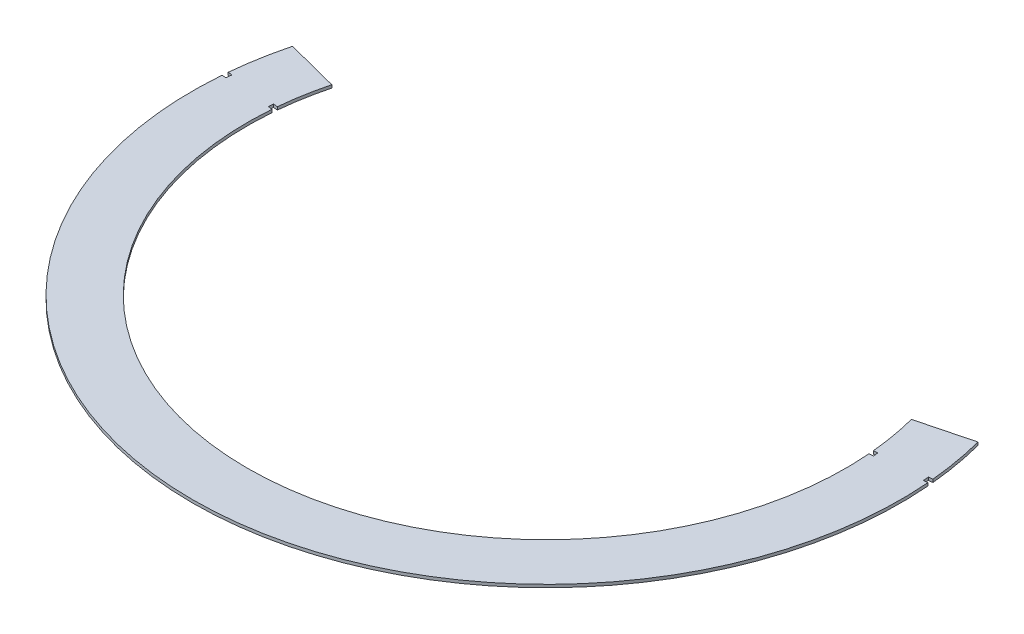
ISO-10303-21;
HEADER;
FILE_DESCRIPTION(('STEP AP214'),'2;1');
FILE_NAME('part.step','',(''),(''),'','','');
FILE_SCHEMA(('AUTOMOTIVE_DESIGN { 1 0 10303 214 1 1 1 1 }'));
ENDSEC;
DATA;
#1=APPLICATION_CONTEXT('core data for automotive mechanical design processes');
#2=APPLICATION_PROTOCOL_DEFINITION('international standard','automotive_design',2000,#1);
#3=PRODUCT_CONTEXT('',#1,'mechanical');
#4=PRODUCT('Part','Part','',(#3));
#5=PRODUCT_RELATED_PRODUCT_CATEGORY('part','',(#4));
#6=PRODUCT_DEFINITION_FORMATION('','',#4);
#7=PRODUCT_DEFINITION_CONTEXT('part definition',#1,'design');
#8=PRODUCT_DEFINITION('design','',#6,#7);
#9=PRODUCT_DEFINITION_SHAPE('','',#8);
#10=(LENGTH_UNIT() NAMED_UNIT(*) SI_UNIT(.MILLI.,.METRE.));
#11=(NAMED_UNIT(*) PLANE_ANGLE_UNIT() SI_UNIT($,.RADIAN.));
#12=(NAMED_UNIT(*) SI_UNIT($,.STERADIAN.) SOLID_ANGLE_UNIT());
#13=UNCERTAINTY_MEASURE_WITH_UNIT(LENGTH_MEASURE(1.E-05),#10,'distance_accuracy_value','');
#14=(GEOMETRIC_REPRESENTATION_CONTEXT(3) GLOBAL_UNCERTAINTY_ASSIGNED_CONTEXT((#13)) GLOBAL_UNIT_ASSIGNED_CONTEXT((#10,
#11,#12)) REPRESENTATION_CONTEXT('',''));
#15=CARTESIAN_POINT('',(0.,0.,0.));
#16=DIRECTION('',(0.,0.,1.));
#17=DIRECTION('',(1.,0.,0.));
#18=AXIS2_PLACEMENT_3D('',#15,#16,#17);
#19=CARTESIAN_POINT('',(-70.9920846280338,0.35,-5.69318190172193));
#20=DIRECTION('',(-0.0799379654833183,0.,0.996799840326225));
#21=DIRECTION('',(0.996799840326225,0.,0.0799379654833183));
#22=AXIS2_PLACEMENT_3D('',#19,#20,#21);
#23=PLANE('',#22);
#24=DIRECTION('',(0.,1.,0.));
#25=VECTOR('',#24,1.);
#26=CARTESIAN_POINT('',(-71.9797048813756,-21.7035849312303,-5.77238371388958));
#27=LINE('',#26,#25);
#28=CARTESIAN_POINT('',(-71.9797048813756,-0.35,-5.77238371388958));
#29=VERTEX_POINT('',#28);
#30=CARTESIAN_POINT('',(-71.9797048813756,0.35,-5.77238371388958));
#31=VERTEX_POINT('',#30);
#32=EDGE_CURVE('E59',#29,#31,#27,.T.);
#33=ORIENTED_EDGE('',*,*,#32,.T.);
#34=DIRECTION('',(-0.996799840326225,0.,-0.0799379654833183));
#35=VECTOR('',#34,1.);
#36=CARTESIAN_POINT('',(-70.9920846280338,0.35,-5.69318190172193));
#37=LINE('',#36,#35);
#38=CARTESIAN_POINT('',(-70.9920846280338,0.35,-5.69318190172193));
#39=VERTEX_POINT('',#38);
#40=EDGE_CURVE('E290',#39,#31,#37,.T.);
#41=ORIENTED_EDGE('',*,*,#40,.F.);
#42=DIRECTION('',(0.,-1.,0.));
#43=VECTOR('',#42,1.);
#44=CARTESIAN_POINT('',(-70.9920846280338,0.35,-5.69318190172193));
#45=LINE('',#44,#43);
#46=CARTESIAN_POINT('',(-70.9920846280338,-0.35,-5.69318190172193));
#47=VERTEX_POINT('',#46);
#48=EDGE_CURVE('E11',#39,#47,#45,.T.);
#49=ORIENTED_EDGE('',*,*,#48,.T.);
#50=DIRECTION('',(-0.996799840326225,0.,-0.0799379654833183));
#51=VECTOR('',#50,1.);
#52=CARTESIAN_POINT('',(-70.9920846280338,-0.35,-5.69318190172193));
#53=LINE('',#52,#51);
#54=EDGE_CURVE('E302',#47,#29,#53,.T.);
#55=ORIENTED_EDGE('',*,*,#54,.T.);
#56=EDGE_LOOP('',(#33,#41,#49,#55));
#57=FACE_BOUND('',#56,.T.);
#58=ADVANCED_FACE('F36',(#57),#23,.F.);
#59=CARTESIAN_POINT('',(70.9920846280338,0.35,-5.69318190172195));
#60=DIRECTION('',(0.0799379654833186,0.,0.996799840326225));
#61=DIRECTION('',(0.996799840326225,0.,-0.0799379654833186));
#62=AXIS2_PLACEMENT_3D('',#59,#60,#61);
#63=PLANE('',#62);
#64=DIRECTION('',(0.,1.,0.));
#65=VECTOR('',#64,1.);
#66=CARTESIAN_POINT('',(82.9642618126462,-21.7035849312303,-6.65328587428129));
#67=LINE('',#66,#65);
#68=CARTESIAN_POINT('',(82.9642618126462,-0.35,-6.65328587428129));
#69=VERTEX_POINT('',#68);
#70=CARTESIAN_POINT('',(82.9642618126462,0.35,-6.65328587428129));
#71=VERTEX_POINT('',#70);
#72=EDGE_CURVE('E271',#69,#71,#67,.T.);
#73=ORIENTED_EDGE('',*,*,#72,.T.);
#74=DIRECTION('',(-0.996799840326225,0.,0.0799379654833186));
#75=VECTOR('',#74,1.);
#76=CARTESIAN_POINT('',(70.9920846280338,0.35,-5.69318190172195));
#77=LINE('',#76,#75);
#78=CARTESIAN_POINT('',(83.9504825522747,0.35,-6.73237545300509));
#79=VERTEX_POINT('',#78);
#80=EDGE_CURVE('E295',#79,#71,#77,.T.);
#81=ORIENTED_EDGE('',*,*,#80,.F.);
#82=DIRECTION('',(0.,-1.,0.));
#83=VECTOR('',#82,1.);
#84=CARTESIAN_POINT('',(83.9504825522747,0.35,-6.73237545300509));
#85=LINE('',#84,#83);
#86=CARTESIAN_POINT('',(83.9504825522747,-0.35,-6.73237545300509));
#87=VERTEX_POINT('',#86);
#88=EDGE_CURVE('E310',#79,#87,#85,.T.);
#89=ORIENTED_EDGE('',*,*,#88,.T.);
#90=DIRECTION('',(-0.996799840326225,0.,0.0799379654833186));
#91=VECTOR('',#90,1.);
#92=CARTESIAN_POINT('',(70.9920846280338,-0.35,-5.69318190172195));
#93=LINE('',#92,#91);
#94=EDGE_CURVE('E289',#87,#69,#93,.T.);
#95=ORIENTED_EDGE('',*,*,#94,.T.);
#96=EDGE_LOOP('',(#73,#81,#89,#95));
#97=FACE_BOUND('',#96,.T.);
#98=ADVANCED_FACE('F325',(#97),#63,.F.);
#99=CARTESIAN_POINT('',(0.,0.35,0.));
#100=DIRECTION('',(0.,-1.,0.));
#101=DIRECTION('',(0.,0.,-1.));
#102=AXIS2_PLACEMENT_3D('',#99,#100,#101);
#103=CYLINDRICAL_SURFACE('',#102,71.22);
#104=CARTESIAN_POINT('',(0.,-0.35,0.));
#105=DIRECTION('',(0.,-1.,0.));
#106=DIRECTION('',(0.,0.,1.));
#107=AXIS2_PLACEMENT_3D('',#104,#105,#106);
#108=CIRCLE('',#107,71.22);
#109=CARTESIAN_POINT('',(70.9920846280338,-0.35,-5.69318190172195));
#110=VERTEX_POINT('',#109);
#111=EDGE_CURVE('E286',#110,#47,#108,.T.);
#112=ORIENTED_EDGE('',*,*,#111,.T.);
#113=ORIENTED_EDGE('',*,*,#48,.F.);
#114=CARTESIAN_POINT('',(0.,0.35,0.));
#115=DIRECTION('',(0.,-1.,0.));
#116=DIRECTION('',(0.,0.,1.));
#117=AXIS2_PLACEMENT_3D('',#114,#115,#116);
#118=CIRCLE('',#117,71.22);
#119=CARTESIAN_POINT('',(70.9920846280338,0.35,-5.69318190172195));
#120=VERTEX_POINT('',#119);
#121=EDGE_CURVE('E287',#120,#39,#118,.T.);
#122=ORIENTED_EDGE('',*,*,#121,.F.);
#123=DIRECTION('',(0.,-1.,0.));
#124=VECTOR('',#123,1.);
#125=CARTESIAN_POINT('',(70.9920846280338,0.35,-5.69318190172195));
#126=LINE('',#125,#124);
#127=EDGE_CURVE('E298',#120,#110,#126,.T.);
#128=ORIENTED_EDGE('',*,*,#127,.T.);
#129=EDGE_LOOP('',(#112,#113,#122,#128));
#130=FACE_BOUND('',#129,.T.);
#131=ADVANCED_FACE('F38',(#130),#103,.F.);
#132=CARTESIAN_POINT('',(-82.9642618126462,0.35,-6.65328587428127));
#133=VERTEX_POINT('',#132);
#134=CARTESIAN_POINT('',(-83.9504825522747,0.35,-6.7323754530051));
#135=VERTEX_POINT('',#134);
#136=EDGE_CURVE('E51',#133,#135,#37,.T.);
#137=ORIENTED_EDGE('',*,*,#136,.F.);
#138=DIRECTION('',(0.,1.,0.));
#139=VECTOR('',#138,1.);
#140=CARTESIAN_POINT('',(-82.9642618126462,-21.7035849312303,-6.65328587428127));
#141=LINE('',#140,#139);
#142=CARTESIAN_POINT('',(-82.9642618126462,-0.35,-6.65328587428127));
#143=VERTEX_POINT('',#142);
#144=EDGE_CURVE('E221',#143,#133,#141,.T.);
#145=ORIENTED_EDGE('',*,*,#144,.F.);
#146=CARTESIAN_POINT('',(-83.9504825522747,-0.35,-6.7323754530051));
#147=VERTEX_POINT('',#146);
#148=EDGE_CURVE('E301',#143,#147,#53,.T.);
#149=ORIENTED_EDGE('',*,*,#148,.T.);
#150=DIRECTION('',(0.,-1.,0.));
#151=VECTOR('',#150,1.);
#152=CARTESIAN_POINT('',(-83.9504825522747,0.35,-6.7323754530051));
#153=LINE('',#152,#151);
#154=EDGE_CURVE('E44',#135,#147,#153,.T.);
#155=ORIENTED_EDGE('',*,*,#154,.F.);
#156=EDGE_LOOP('',(#137,#145,#149,#155));
#157=FACE_BOUND('',#156,.T.);
#158=ADVANCED_FACE('F393',(#157),#23,.F.);
#159=CARTESIAN_POINT('',(0.,0.35,0.));
#160=DIRECTION('',(0.,-1.,0.));
#161=DIRECTION('',(0.,0.,-1.));
#162=AXIS2_PLACEMENT_3D('',#159,#160,#161);
#163=CYLINDRICAL_SURFACE('',#162,84.22);
#164=CARTESIAN_POINT('',(0.,-0.35,0.));
#165=DIRECTION('',(0.,1.,0.));
#166=DIRECTION('',(0.,0.,1.));
#167=AXIS2_PLACEMENT_3D('',#164,#165,#166);
#168=CIRCLE('',#167,84.22);
#169=EDGE_CURVE('E304',#147,#87,#168,.T.);
#170=ORIENTED_EDGE('',*,*,#169,.T.);
#171=ORIENTED_EDGE('',*,*,#88,.F.);
#172=CARTESIAN_POINT('',(0.,0.35,0.));
#173=DIRECTION('',(0.,1.,0.));
#174=DIRECTION('',(0.,0.,1.));
#175=AXIS2_PLACEMENT_3D('',#172,#173,#174);
#176=CIRCLE('',#175,84.22);
#177=EDGE_CURVE('E292',#135,#79,#176,.T.);
#178=ORIENTED_EDGE('',*,*,#177,.F.);
#179=ORIENTED_EDGE('',*,*,#154,.T.);
#180=EDGE_LOOP('',(#170,#171,#178,#179));
#181=FACE_BOUND('',#180,.T.);
#182=ADVANCED_FACE('F316',(#181),#163,.T.);
#183=CARTESIAN_POINT('',(71.9797048813755,0.35,-5.7723837138896));
#184=VERTEX_POINT('',#183);
#185=EDGE_CURVE('E294',#184,#120,#77,.T.);
#186=ORIENTED_EDGE('',*,*,#185,.F.);
#187=DIRECTION('',(0.,1.,0.));
#188=VECTOR('',#187,1.);
#189=CARTESIAN_POINT('',(71.9797048813755,-21.7035849312303,-5.7723837138896));
#190=LINE('',#189,#188);
#191=CARTESIAN_POINT('',(71.9797048813755,-0.35,-5.7723837138896));
#192=VERTEX_POINT('',#191);
#193=EDGE_CURVE('E273',#192,#184,#190,.T.);
#194=ORIENTED_EDGE('',*,*,#193,.F.);
#195=EDGE_CURVE('E306',#192,#110,#93,.T.);
#196=ORIENTED_EDGE('',*,*,#195,.T.);
#197=ORIENTED_EDGE('',*,*,#127,.F.);
#198=EDGE_LOOP('',(#186,#194,#196,#197));
#199=FACE_BOUND('',#198,.T.);
#200=ADVANCED_FACE('F361',(#199),#63,.F.);
#201=CARTESIAN_POINT('',(0.,0.35,0.));
#202=DIRECTION('',(0.,1.,0.));
#203=DIRECTION('',(0.,0.,1.));
#204=AXIS2_PLACEMENT_3D('',#201,#202,#203);
#205=PLANE('',#204);
#206=ORIENTED_EDGE('',*,*,#121,.T.);
#207=ORIENTED_EDGE('',*,*,#40,.T.);
#208=DIRECTION('',(-0.0799379654833196,0.,0.996799840326225));
#209=VECTOR('',#208,1.);
#210=CARTESIAN_POINT('',(-71.9797048813755,0.35,-5.77238371388967));
#211=LINE('',#210,#209);
#212=CARTESIAN_POINT('',(-71.8875134460776,0.35,-6.92198024701075));
#213=VERTEX_POINT('',#212);
#214=EDGE_CURVE('E211',#213,#31,#211,.T.);
#215=ORIENTED_EDGE('',*,*,#214,.F.);
#216=DIRECTION('',(-0.995396198367179,0.,-0.0958457525202264));
#217=VECTOR('',#216,1.);
#218=CARTESIAN_POINT('',(0.,0.35,0.));
#219=LINE('',#218,#217);
#220=CARTESIAN_POINT('',(-70.8921172477104,0.35,-6.82613449449052));
#221=VERTEX_POINT('',#220);
#222=EDGE_CURVE('E185',#221,#213,#219,.T.);
#223=ORIENTED_EDGE('',*,*,#222,.F.);
#224=CARTESIAN_POINT('',(0.,0.35,0.));
#225=DIRECTION('',(0.,1.,0.));
#226=DIRECTION('',(0.,0.,1.));
#227=AXIS2_PLACEMENT_3D('',#224,#225,#226);
#228=CIRCLE('',#227,71.22);
#229=CARTESIAN_POINT('',(-68.9514749477288,0.35,-17.8320638887573));
#230=VERTEX_POINT('',#229);
#231=EDGE_CURVE('E179',#230,#221,#228,.T.);
#232=ORIENTED_EDGE('',*,*,#231,.F.);
#233=DIRECTION('',(-0.968147640378108,0.,-0.250380004054441));
#234=VECTOR('',#233,1.);
#235=CARTESIAN_POINT('',(0.,0.35,0.));
#236=LINE('',#235,#234);
#237=CARTESIAN_POINT('',(-81.5373942726442,0.35,-21.087003941465));
#238=VERTEX_POINT('',#237);
#239=EDGE_CURVE('E193',#230,#238,#236,.T.);
#240=ORIENTED_EDGE('',*,*,#239,.T.);
#241=CARTESIAN_POINT('',(0.,0.35,0.));
#242=DIRECTION('',(0.,1.,0.));
#243=DIRECTION('',(0.,0.,1.));
#244=AXIS2_PLACEMENT_3D('',#241,#242,#243);
#245=CIRCLE('',#244,84.22);
#246=CARTESIAN_POINT('',(-83.8322678264837,0.35,-8.07212927725383));
#247=VERTEX_POINT('',#246);
#248=EDGE_CURVE('E200',#238,#247,#245,.T.);
#249=ORIENTED_EDGE('',*,*,#248,.T.);
#250=DIRECTION('',(0.995396198367178,0.,0.0958457525202307));
#251=VECTOR('',#250,1.);
#252=CARTESIAN_POINT('',(0.,0.35,0.));
#253=LINE('',#252,#251);
#254=CARTESIAN_POINT('',(-82.8368716281166,0.35,-7.9762835247336));
#255=VERTEX_POINT('',#254);
#256=EDGE_CURVE('E202',#247,#255,#253,.T.);
#257=ORIENTED_EDGE('',*,*,#256,.T.);
#258=DIRECTION('',(-0.0958457525202373,0.,0.995396198367178));
#259=VECTOR('',#258,1.);
#260=CARTESIAN_POINT('',(-82.8368716281165,0.35,-7.97628352473415));
#261=LINE('',#260,#259);
#262=EDGE_CURVE('E208',#255,#133,#261,.T.);
#263=ORIENTED_EDGE('',*,*,#262,.T.);
#264=ORIENTED_EDGE('',*,*,#136,.T.);
#265=ORIENTED_EDGE('',*,*,#177,.T.);
#266=ORIENTED_EDGE('',*,*,#80,.T.);
#267=DIRECTION('',(0.0958457525202372,0.,0.995396198367178));
#268=VECTOR('',#267,1.);
#269=CARTESIAN_POINT('',(82.8368716281165,0.35,-7.97628352473414));
#270=LINE('',#269,#268);
#271=CARTESIAN_POINT('',(82.8368716281166,0.35,-7.97628352473359));
#272=VERTEX_POINT('',#271);
#273=EDGE_CURVE('E266',#272,#71,#270,.T.);
#274=ORIENTED_EDGE('',*,*,#273,.F.);
#275=DIRECTION('',(-0.995396198367178,0.,0.0958457525202307));
#276=VECTOR('',#275,1.);
#277=CARTESIAN_POINT('',(0.,0.35,0.));
#278=LINE('',#277,#276);
#279=CARTESIAN_POINT('',(83.8322678264837,0.35,-8.07212927725383));
#280=VERTEX_POINT('',#279);
#281=EDGE_CURVE('E230',#280,#272,#278,.T.);
#282=ORIENTED_EDGE('',*,*,#281,.F.);
#283=CARTESIAN_POINT('',(0.,0.35,0.));
#284=DIRECTION('',(0.,1.,0.));
#285=DIRECTION('',(0.,0.,1.));
#286=AXIS2_PLACEMENT_3D('',#283,#284,#285);
#287=CIRCLE('',#286,84.22);
#288=CARTESIAN_POINT('',(81.5373942726442,0.35,-21.087003941465));
#289=VERTEX_POINT('',#288);
#290=EDGE_CURVE('E251',#280,#289,#287,.T.);
#291=ORIENTED_EDGE('',*,*,#290,.T.);
#292=DIRECTION('',(0.968147640378108,0.,-0.250380004054441));
#293=VECTOR('',#292,1.);
#294=CARTESIAN_POINT('',(0.,0.35,0.));
#295=LINE('',#294,#293);
#296=CARTESIAN_POINT('',(68.9514749477288,0.35,-17.8320638887573));
#297=VERTEX_POINT('',#296);
#298=EDGE_CURVE('E254',#297,#289,#295,.T.);
#299=ORIENTED_EDGE('',*,*,#298,.F.);
#300=CARTESIAN_POINT('',(0.,0.35,0.));
#301=DIRECTION('',(0.,1.,0.));
#302=DIRECTION('',(0.,0.,1.));
#303=AXIS2_PLACEMENT_3D('',#300,#301,#302);
#304=CIRCLE('',#303,71.22);
#305=CARTESIAN_POINT('',(70.8921172477104,0.35,-6.82613449449058));
#306=VERTEX_POINT('',#305);
#307=EDGE_CURVE('E257',#306,#297,#304,.T.);
#308=ORIENTED_EDGE('',*,*,#307,.F.);
#309=DIRECTION('',(0.995396198367179,0.,-0.0958457525202273));
#310=VECTOR('',#309,1.);
#311=CARTESIAN_POINT('',(0.,0.35,0.));
#312=LINE('',#311,#310);
#313=CARTESIAN_POINT('',(71.8875134460776,0.35,-6.92198024701105));
#314=VERTEX_POINT('',#313);
#315=EDGE_CURVE('E260',#306,#314,#312,.T.);
#316=ORIENTED_EDGE('',*,*,#315,.T.);
#317=DIRECTION('',(0.0799379654832954,0.,0.996799840326227));
#318=VECTOR('',#317,1.);
#319=CARTESIAN_POINT('',(71.9797048813756,0.35,-5.77238371388792));
#320=LINE('',#319,#318);
#321=EDGE_CURVE('E263',#314,#184,#320,.T.);
#322=ORIENTED_EDGE('',*,*,#321,.T.);
#323=ORIENTED_EDGE('',*,*,#185,.T.);
#324=EDGE_LOOP('',(#206,#207,#215,#223,#232,#240,#249,#257,#263,#264,#265,#266,#274,#282,#291,
#299,#308,#316,#322,#323));
#325=FACE_BOUND('',#324,.T.);
#326=ADVANCED_FACE('F191',(#325),#205,.T.);
#327=CARTESIAN_POINT('',(0.,-0.35,0.));
#328=DIRECTION('',(0.,1.,0.));
#329=DIRECTION('',(0.,0.,1.));
#330=AXIS2_PLACEMENT_3D('',#327,#328,#329);
#331=PLANE('',#330);
#332=ORIENTED_EDGE('',*,*,#111,.F.);
#333=ORIENTED_EDGE('',*,*,#195,.F.);
#334=DIRECTION('',(-0.0799379654832954,0.,-0.996799840326227));
#335=VECTOR('',#334,1.);
#336=CARTESIAN_POINT('',(71.9797048813756,-0.35,-5.77238371388792));
#337=LINE('',#336,#335);
#338=CARTESIAN_POINT('',(71.8875134460776,-0.35,-6.92198024701081));
#339=VERTEX_POINT('',#338);
#340=EDGE_CURVE('E240',#192,#339,#337,.T.);
#341=ORIENTED_EDGE('',*,*,#340,.T.);
#342=DIRECTION('',(-0.995396198367179,0.,0.0958457525202273));
#343=VECTOR('',#342,1.);
#344=CARTESIAN_POINT('',(0.,-0.35,0.));
#345=LINE('',#344,#343);
#346=CARTESIAN_POINT('',(70.8921172477104,-0.35,-6.82613449449059));
#347=VERTEX_POINT('',#346);
#348=EDGE_CURVE('E238',#339,#347,#345,.T.);
#349=ORIENTED_EDGE('',*,*,#348,.T.);
#350=CARTESIAN_POINT('',(0.,-0.35,0.));
#351=DIRECTION('',(0.,1.,0.));
#352=DIRECTION('',(0.,0.,1.));
#353=AXIS2_PLACEMENT_3D('',#350,#351,#352);
#354=CIRCLE('',#353,71.22);
#355=CARTESIAN_POINT('',(68.9514749477288,-0.35,-17.8320638887573));
#356=VERTEX_POINT('',#355);
#357=EDGE_CURVE('E234',#356,#347,#354,.F.);
#358=ORIENTED_EDGE('',*,*,#357,.F.);
#359=DIRECTION('',(-0.968147640378108,0.,0.250380004054441));
#360=VECTOR('',#359,1.);
#361=CARTESIAN_POINT('',(0.,-0.35,0.));
#362=LINE('',#361,#360);
#363=CARTESIAN_POINT('',(81.5373942726442,-0.35,-21.087003941465));
#364=VERTEX_POINT('',#363);
#365=EDGE_CURVE('E231',#364,#356,#362,.T.);
#366=ORIENTED_EDGE('',*,*,#365,.F.);
#367=CARTESIAN_POINT('',(0.,-0.35,0.));
#368=DIRECTION('',(0.,1.,0.));
#369=DIRECTION('',(0.,0.,1.));
#370=AXIS2_PLACEMENT_3D('',#367,#368,#369);
#371=CIRCLE('',#370,84.22);
#372=CARTESIAN_POINT('',(83.8322678264837,-0.35,-8.07212927725383));
#373=VERTEX_POINT('',#372);
#374=EDGE_CURVE('E248',#364,#373,#371,.F.);
#375=ORIENTED_EDGE('',*,*,#374,.T.);
#376=DIRECTION('',(0.995396198367178,0.,-0.0958457525202307));
#377=VECTOR('',#376,1.);
#378=CARTESIAN_POINT('',(0.,-0.35,0.));
#379=LINE('',#378,#377);
#380=CARTESIAN_POINT('',(82.8368716281166,-0.35,-7.97628352473359));
#381=VERTEX_POINT('',#380);
#382=EDGE_CURVE('E245',#381,#373,#379,.T.);
#383=ORIENTED_EDGE('',*,*,#382,.F.);
#384=DIRECTION('',(-0.0958457525202372,0.,-0.995396198367178));
#385=VECTOR('',#384,1.);
#386=CARTESIAN_POINT('',(82.8368716281165,-0.35,-7.97628352473414));
#387=LINE('',#386,#385);
#388=EDGE_CURVE('E242',#69,#381,#387,.T.);
#389=ORIENTED_EDGE('',*,*,#388,.F.);
#390=ORIENTED_EDGE('',*,*,#94,.F.);
#391=ORIENTED_EDGE('',*,*,#169,.F.);
#392=ORIENTED_EDGE('',*,*,#148,.F.);
#393=DIRECTION('',(0.0958457525202373,0.,-0.995396198367178));
#394=VECTOR('',#393,1.);
#395=CARTESIAN_POINT('',(-82.8368716281165,-0.35,-7.97628352473415));
#396=LINE('',#395,#394);
#397=CARTESIAN_POINT('',(-82.8368716281166,-0.35,-7.9762835247336));
#398=VERTEX_POINT('',#397);
#399=EDGE_CURVE('E374',#143,#398,#396,.T.);
#400=ORIENTED_EDGE('',*,*,#399,.T.);
#401=DIRECTION('',(-0.995396198367178,0.,-0.0958457525202307));
#402=VECTOR('',#401,1.);
#403=CARTESIAN_POINT('',(0.,-0.35,0.));
#404=LINE('',#403,#402);
#405=CARTESIAN_POINT('',(-83.8322678264837,-0.35,-8.07212927725383));
#406=VERTEX_POINT('',#405);
#407=EDGE_CURVE('E378',#398,#406,#404,.T.);
#408=ORIENTED_EDGE('',*,*,#407,.T.);
#409=CARTESIAN_POINT('',(0.,-0.35,0.));
#410=DIRECTION('',(0.,1.,0.));
#411=DIRECTION('',(0.,0.,1.));
#412=AXIS2_PLACEMENT_3D('',#409,#410,#411);
#413=CIRCLE('',#412,84.22);
#414=CARTESIAN_POINT('',(-81.5373942726442,-0.35,-21.087003941465));
#415=VERTEX_POINT('',#414);
#416=EDGE_CURVE('E217',#406,#415,#413,.F.);
#417=ORIENTED_EDGE('',*,*,#416,.T.);
#418=DIRECTION('',(0.968147640378108,0.,0.250380004054441));
#419=VECTOR('',#418,1.);
#420=CARTESIAN_POINT('',(0.,-0.35,0.));
#421=LINE('',#420,#419);
#422=CARTESIAN_POINT('',(-68.9514749477288,-0.35,-17.8320638887573));
#423=VERTEX_POINT('',#422);
#424=EDGE_CURVE('E228',#415,#423,#421,.T.);
#425=ORIENTED_EDGE('',*,*,#424,.T.);
#426=CARTESIAN_POINT('',(0.,-0.35,0.));
#427=DIRECTION('',(0.,1.,0.));
#428=DIRECTION('',(0.,0.,1.));
#429=AXIS2_PLACEMENT_3D('',#426,#427,#428);
#430=CIRCLE('',#429,71.22);
#431=CARTESIAN_POINT('',(-70.8921172477105,-0.35,-6.82613449449052));
#432=VERTEX_POINT('',#431);
#433=EDGE_CURVE('E180',#432,#423,#430,.F.);
#434=ORIENTED_EDGE('',*,*,#433,.F.);
#435=DIRECTION('',(0.995396198367179,0.,0.0958457525202264));
#436=VECTOR('',#435,1.);
#437=CARTESIAN_POINT('',(0.,-0.35,0.));
#438=LINE('',#437,#436);
#439=CARTESIAN_POINT('',(-71.8875134460776,-0.35,-6.92198024701075));
#440=VERTEX_POINT('',#439);
#441=EDGE_CURVE('E372',#440,#432,#438,.T.);
#442=ORIENTED_EDGE('',*,*,#441,.F.);
#443=DIRECTION('',(0.0799379654833196,0.,-0.996799840326225));
#444=VECTOR('',#443,1.);
#445=CARTESIAN_POINT('',(-71.9797048813755,-0.35,-5.77238371388967));
#446=LINE('',#445,#444);
#447=EDGE_CURVE('E368',#29,#440,#446,.T.);
#448=ORIENTED_EDGE('',*,*,#447,.F.);
#449=ORIENTED_EDGE('',*,*,#54,.F.);
#450=EDGE_LOOP('',(#332,#333,#341,#349,#358,#366,#375,#383,#389,#390,#391,#392,#400,#408,#417,
#425,#434,#442,#448,#449));
#451=FACE_BOUND('',#450,.T.);
#452=ADVANCED_FACE('F321',(#451),#331,.F.);
#453=CARTESIAN_POINT('',(0.,-21.7035849312303,0.));
#454=DIRECTION('',(-0.0958457525202307,0.,-0.995396198367178));
#455=DIRECTION('',(-0.995396198367178,0.,0.0958457525202307));
#456=AXIS2_PLACEMENT_3D('',#453,#454,#455);
#457=PLANE('',#456);
#458=DIRECTION('',(0.,1.,0.));
#459=VECTOR('',#458,1.);
#460=CARTESIAN_POINT('',(82.8368716281166,-21.7035849312303,-7.97628352473359));
#461=LINE('',#460,#459);
#462=EDGE_CURVE('E235',#381,#272,#461,.T.);
#463=ORIENTED_EDGE('',*,*,#462,.F.);
#464=ORIENTED_EDGE('',*,*,#382,.T.);
#465=DIRECTION('',(0.,1.,0.));
#466=VECTOR('',#465,1.);
#467=CARTESIAN_POINT('',(83.8322678264837,-21.7035849312303,-8.07212927725383));
#468=LINE('',#467,#466);
#469=EDGE_CURVE('E269',#373,#280,#468,.T.);
#470=ORIENTED_EDGE('',*,*,#469,.T.);
#471=ORIENTED_EDGE('',*,*,#281,.T.);
#472=EDGE_LOOP('',(#463,#464,#470,#471));
#473=FACE_BOUND('',#472,.T.);
#474=ADVANCED_FACE('F333',(#473),#457,.F.);
#475=CARTESIAN_POINT('',(82.8368716281165,-21.7035849312303,-7.97628352473414));
#476=DIRECTION('',(-0.995396198367178,0.,0.0958457525202372));
#477=DIRECTION('',(0.0958457525202372,0.,0.995396198367178));
#478=AXIS2_PLACEMENT_3D('',#475,#476,#477);
#479=PLANE('',#478);
#480=ORIENTED_EDGE('',*,*,#72,.F.);
#481=ORIENTED_EDGE('',*,*,#388,.T.);
#482=ORIENTED_EDGE('',*,*,#462,.T.);
#483=ORIENTED_EDGE('',*,*,#273,.T.);
#484=EDGE_LOOP('',(#480,#481,#482,#483));
#485=FACE_BOUND('',#484,.T.);
#486=ADVANCED_FACE('F330',(#485),#479,.F.);
#487=CARTESIAN_POINT('',(71.9797048813756,-21.7035849312303,-5.77238371388792));
#488=DIRECTION('',(-0.996799840326227,0.,0.0799379654832954));
#489=DIRECTION('',(0.0799379654832954,0.,0.996799840326227));
#490=AXIS2_PLACEMENT_3D('',#487,#488,#489);
#491=PLANE('',#490);
#492=ORIENTED_EDGE('',*,*,#340,.F.);
#493=ORIENTED_EDGE('',*,*,#193,.T.);
#494=ORIENTED_EDGE('',*,*,#321,.F.);
#495=DIRECTION('',(0.,1.,0.));
#496=VECTOR('',#495,1.);
#497=CARTESIAN_POINT('',(71.8875134460776,-21.7035849312303,-6.92198024701105));
#498=LINE('',#497,#496);
#499=EDGE_CURVE('E276',#339,#314,#498,.T.);
#500=ORIENTED_EDGE('',*,*,#499,.F.);
#501=EDGE_LOOP('',(#492,#493,#494,#500));
#502=FACE_BOUND('',#501,.T.);
#503=ADVANCED_FACE('F355',(#502),#491,.T.);
#504=CARTESIAN_POINT('',(0.,-21.7035849312303,0.));
#505=DIRECTION('',(0.0958457525202273,0.,0.995396198367179));
#506=DIRECTION('',(0.995396198367179,0.,-0.0958457525202273));
#507=AXIS2_PLACEMENT_3D('',#504,#505,#506);
#508=PLANE('',#507);
#509=ORIENTED_EDGE('',*,*,#348,.F.);
#510=ORIENTED_EDGE('',*,*,#499,.T.);
#511=ORIENTED_EDGE('',*,*,#315,.F.);
#512=DIRECTION('',(0.,1.,0.));
#513=VECTOR('',#512,1.);
#514=CARTESIAN_POINT('',(70.8921172477104,-21.7035849312303,-6.82613449449058));
#515=LINE('',#514,#513);
#516=EDGE_CURVE('E278',#347,#306,#515,.T.);
#517=ORIENTED_EDGE('',*,*,#516,.F.);
#518=EDGE_LOOP('',(#509,#510,#511,#517));
#519=FACE_BOUND('',#518,.T.);
#520=ADVANCED_FACE('F350',(#519),#508,.T.);
#521=CARTESIAN_POINT('',(0.,-21.7035849312303,0.));
#522=DIRECTION('',(0.,1.,0.));
#523=DIRECTION('',(0.,0.,1.));
#524=AXIS2_PLACEMENT_3D('',#521,#522,#523);
#525=CYLINDRICAL_SURFACE('',#524,71.22);
#526=DIRECTION('',(0.,1.,0.));
#527=VECTOR('',#526,1.);
#528=CARTESIAN_POINT('',(68.9514749477288,-21.7035849312303,-17.8320638887573));
#529=LINE('',#528,#527);
#530=EDGE_CURVE('E280',#356,#297,#529,.T.);
#531=ORIENTED_EDGE('',*,*,#530,.F.);
#532=ORIENTED_EDGE('',*,*,#357,.T.);
#533=ORIENTED_EDGE('',*,*,#516,.T.);
#534=ORIENTED_EDGE('',*,*,#307,.T.);
#535=EDGE_LOOP('',(#531,#532,#533,#534));
#536=FACE_BOUND('',#535,.T.);
#537=ADVANCED_FACE('F423',(#536),#525,.F.);
#538=CARTESIAN_POINT('',(0.,-21.7035849312303,0.));
#539=DIRECTION('',(0.250380004054441,0.,0.968147640378108));
#540=DIRECTION('',(0.968147640378108,0.,-0.250380004054441));
#541=AXIS2_PLACEMENT_3D('',#538,#539,#540);
#542=PLANE('',#541);
#543=DIRECTION('',(0.,1.,0.));
#544=VECTOR('',#543,1.);
#545=CARTESIAN_POINT('',(81.5373942726442,-21.7035849312303,-21.087003941465));
#546=LINE('',#545,#544);
#547=EDGE_CURVE('E282',#364,#289,#546,.T.);
#548=ORIENTED_EDGE('',*,*,#547,.F.);
#549=ORIENTED_EDGE('',*,*,#365,.T.);
#550=ORIENTED_EDGE('',*,*,#530,.T.);
#551=ORIENTED_EDGE('',*,*,#298,.T.);
#552=EDGE_LOOP('',(#548,#549,#550,#551));
#553=FACE_BOUND('',#552,.T.);
#554=ADVANCED_FACE('F342',(#553),#542,.F.);
#555=CARTESIAN_POINT('',(0.,-21.7035849312303,0.));
#556=DIRECTION('',(0.,1.,0.));
#557=DIRECTION('',(0.,0.,1.));
#558=AXIS2_PLACEMENT_3D('',#555,#556,#557);
#559=CYLINDRICAL_SURFACE('',#558,84.22);
#560=ORIENTED_EDGE('',*,*,#374,.F.);
#561=ORIENTED_EDGE('',*,*,#547,.T.);
#562=ORIENTED_EDGE('',*,*,#290,.F.);
#563=ORIENTED_EDGE('',*,*,#469,.F.);
#564=EDGE_LOOP('',(#560,#561,#562,#563));
#565=FACE_BOUND('',#564,.T.);
#566=ADVANCED_FACE('F339',(#565),#559,.T.);
#567=CARTESIAN_POINT('',(0.,-21.7035849312303,0.));
#568=DIRECTION('',(0.,1.,0.));
#569=DIRECTION('',(0.,0.,1.));
#570=AXIS2_PLACEMENT_3D('',#567,#568,#569);
#571=CYLINDRICAL_SURFACE('',#570,71.22);
#572=DIRECTION('',(0.,1.,0.));
#573=VECTOR('',#572,1.);
#574=CARTESIAN_POINT('',(-70.8921172477104,-21.7035849312303,-6.82613449449052));
#575=LINE('',#574,#573);
#576=EDGE_CURVE('E215',#432,#221,#575,.T.);
#577=ORIENTED_EDGE('',*,*,#576,.F.);
#578=ORIENTED_EDGE('',*,*,#433,.T.);
#579=DIRECTION('',(0.,1.,0.));
#580=VECTOR('',#579,1.);
#581=CARTESIAN_POINT('',(-68.9514749477288,-21.7035849312303,-17.8320638887573));
#582=LINE('',#581,#580);
#583=EDGE_CURVE('E175',#423,#230,#582,.T.);
#584=ORIENTED_EDGE('',*,*,#583,.T.);
#585=ORIENTED_EDGE('',*,*,#231,.T.);
#586=EDGE_LOOP('',(#577,#578,#584,#585));
#587=FACE_BOUND('',#586,.T.);
#588=ADVANCED_FACE('F178',(#587),#571,.F.);
#589=CARTESIAN_POINT('',(0.,-21.7035849312303,0.));
#590=DIRECTION('',(0.0958457525202264,0.,-0.995396198367179));
#591=DIRECTION('',(-0.995396198367179,0.,-0.0958457525202264));
#592=AXIS2_PLACEMENT_3D('',#589,#590,#591);
#593=PLANE('',#592);
#594=DIRECTION('',(0.,1.,0.));
#595=VECTOR('',#594,1.);
#596=CARTESIAN_POINT('',(-71.8875134460776,-21.7035849312303,-6.92198024701075));
#597=LINE('',#596,#595);
#598=EDGE_CURVE('E218',#440,#213,#597,.T.);
#599=ORIENTED_EDGE('',*,*,#598,.F.);
#600=ORIENTED_EDGE('',*,*,#441,.T.);
#601=ORIENTED_EDGE('',*,*,#576,.T.);
#602=ORIENTED_EDGE('',*,*,#222,.T.);
#603=EDGE_LOOP('',(#599,#600,#601,#602));
#604=FACE_BOUND('',#603,.T.);
#605=ADVANCED_FACE('F371',(#604),#593,.F.);
#606=CARTESIAN_POINT('',(-71.9797048813755,-21.7035849312303,-5.77238371388967));
#607=DIRECTION('',(-0.996799840326225,0.,-0.0799379654833196));
#608=DIRECTION('',(-0.0799379654833196,0.,0.996799840326225));
#609=AXIS2_PLACEMENT_3D('',#606,#607,#608);
#610=PLANE('',#609);
#611=ORIENTED_EDGE('',*,*,#32,.F.);
#612=ORIENTED_EDGE('',*,*,#447,.T.);
#613=ORIENTED_EDGE('',*,*,#598,.T.);
#614=ORIENTED_EDGE('',*,*,#214,.T.);
#615=EDGE_LOOP('',(#611,#612,#613,#614));
#616=FACE_BOUND('',#615,.T.);
#617=ADVANCED_FACE('F365',(#616),#610,.F.);
#618=CARTESIAN_POINT('',(-82.8368716281165,-21.7035849312303,-7.97628352473415));
#619=DIRECTION('',(-0.995396198367178,0.,-0.0958457525202373));
#620=DIRECTION('',(-0.0958457525202373,0.,0.995396198367178));
#621=AXIS2_PLACEMENT_3D('',#618,#619,#620);
#622=PLANE('',#621);
#623=ORIENTED_EDGE('',*,*,#399,.F.);
#624=ORIENTED_EDGE('',*,*,#144,.T.);
#625=ORIENTED_EDGE('',*,*,#262,.F.);
#626=DIRECTION('',(0.,1.,0.));
#627=VECTOR('',#626,1.);
#628=CARTESIAN_POINT('',(-82.8368716281166,-21.7035849312303,-7.9762835247336));
#629=LINE('',#628,#627);
#630=EDGE_CURVE('E223',#398,#255,#629,.T.);
#631=ORIENTED_EDGE('',*,*,#630,.F.);
#632=EDGE_LOOP('',(#623,#624,#625,#631));
#633=FACE_BOUND('',#632,.T.);
#634=ADVANCED_FACE('F392',(#633),#622,.T.);
#635=CARTESIAN_POINT('',(0.,-21.7035849312303,0.));
#636=DIRECTION('',(-0.0958457525202307,0.,0.995396198367178));
#637=DIRECTION('',(0.995396198367178,0.,0.0958457525202307));
#638=AXIS2_PLACEMENT_3D('',#635,#636,#637);
#639=PLANE('',#638);
#640=ORIENTED_EDGE('',*,*,#407,.F.);
#641=ORIENTED_EDGE('',*,*,#630,.T.);
#642=ORIENTED_EDGE('',*,*,#256,.F.);
#643=DIRECTION('',(0.,1.,0.));
#644=VECTOR('',#643,1.);
#645=CARTESIAN_POINT('',(-83.8322678264837,-21.7035849312303,-8.07212927725383));
#646=LINE('',#645,#644);
#647=EDGE_CURVE('E225',#406,#247,#646,.T.);
#648=ORIENTED_EDGE('',*,*,#647,.F.);
#649=EDGE_LOOP('',(#640,#641,#642,#648));
#650=FACE_BOUND('',#649,.T.);
#651=ADVANCED_FACE('F388',(#650),#639,.T.);
#652=CARTESIAN_POINT('',(0.,-21.7035849312303,0.));
#653=DIRECTION('',(0.,1.,0.));
#654=DIRECTION('',(0.,0.,1.));
#655=AXIS2_PLACEMENT_3D('',#652,#653,#654);
#656=CYLINDRICAL_SURFACE('',#655,84.22);
#657=ORIENTED_EDGE('',*,*,#416,.F.);
#658=ORIENTED_EDGE('',*,*,#647,.T.);
#659=ORIENTED_EDGE('',*,*,#248,.F.);
#660=DIRECTION('',(0.,1.,0.));
#661=VECTOR('',#660,1.);
#662=CARTESIAN_POINT('',(-81.5373942726442,-21.7035849312303,-21.087003941465));
#663=LINE('',#662,#661);
#664=EDGE_CURVE('E184',#415,#238,#663,.T.);
#665=ORIENTED_EDGE('',*,*,#664,.F.);
#666=EDGE_LOOP('',(#657,#658,#659,#665));
#667=FACE_BOUND('',#666,.T.);
#668=ADVANCED_FACE('F384',(#667),#656,.T.);
#669=CARTESIAN_POINT('',(0.,-21.7035849312303,0.));
#670=DIRECTION('',(0.250380004054441,0.,-0.968147640378108));
#671=DIRECTION('',(-0.968147640378108,0.,-0.250380004054441));
#672=AXIS2_PLACEMENT_3D('',#669,#670,#671);
#673=PLANE('',#672);
#674=ORIENTED_EDGE('',*,*,#424,.F.);
#675=ORIENTED_EDGE('',*,*,#664,.T.);
#676=ORIENTED_EDGE('',*,*,#239,.F.);
#677=ORIENTED_EDGE('',*,*,#583,.F.);
#678=EDGE_LOOP('',(#674,#675,#676,#677));
#679=FACE_BOUND('',#678,.T.);
#680=ADVANCED_FACE('F197',(#679),#673,.T.);
#681=CLOSED_SHELL('',(#58,#98,#131,#158,#182,#200,#326,#452,#474,#486,#503,#520,#537,#554,#566,
#588,#605,#617,#634,#651,#668,#680));
#682=MANIFOLD_SOLID_BREP('B2',#681);
#683=ADVANCED_BREP_SHAPE_REPRESENTATION('',(#18,#682),#14);
#684=SHAPE_DEFINITION_REPRESENTATION(#9,#683);
ENDSEC;
END-ISO-10303-21;
